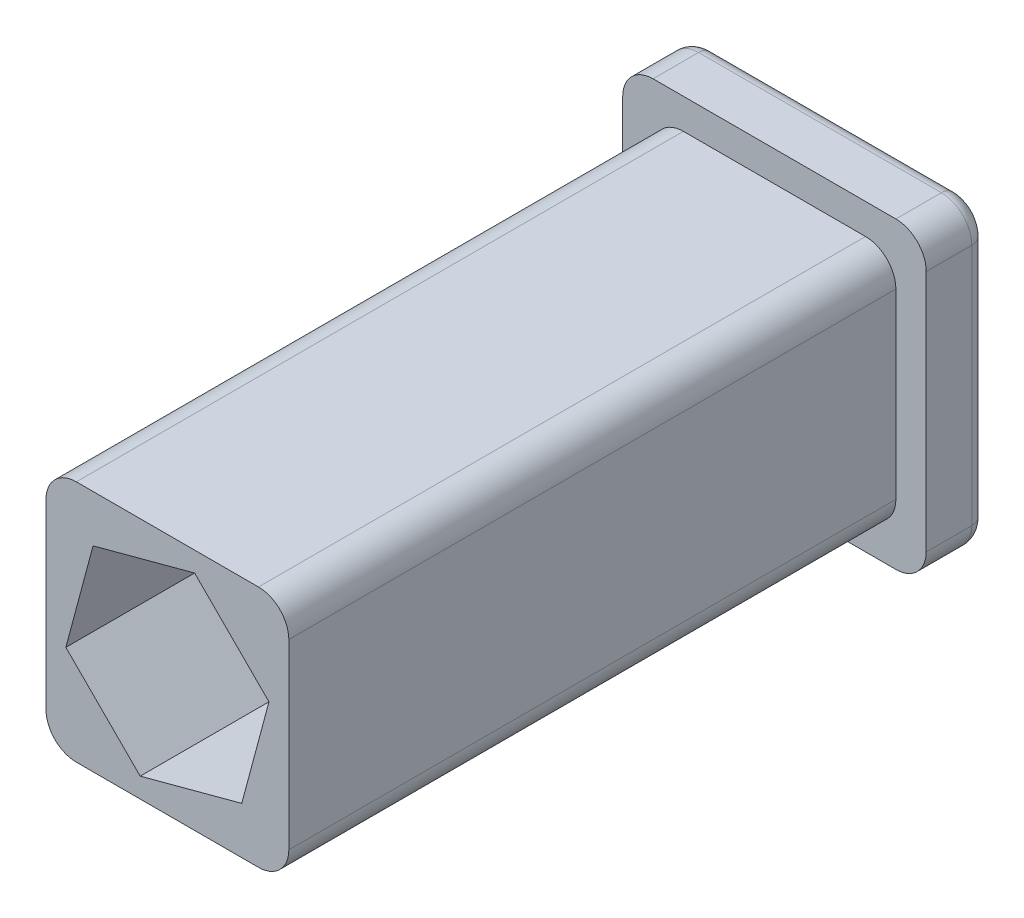
ISO-10303-21;
HEADER;
FILE_DESCRIPTION(('STEP AP214'),'2;1');
FILE_NAME('part.step','',(''),(''),'','','');
FILE_SCHEMA(('AUTOMOTIVE_DESIGN { 1 0 10303 214 1 1 1 1 }'));
ENDSEC;
DATA;
#1=APPLICATION_CONTEXT('core data for automotive mechanical design processes');
#2=APPLICATION_PROTOCOL_DEFINITION('international standard','automotive_design',2000,#1);
#3=PRODUCT_CONTEXT('',#1,'mechanical');
#4=PRODUCT('Part','Part','',(#3));
#5=PRODUCT_RELATED_PRODUCT_CATEGORY('part','',(#4));
#6=PRODUCT_DEFINITION_FORMATION('','',#4);
#7=PRODUCT_DEFINITION_CONTEXT('part definition',#1,'design');
#8=PRODUCT_DEFINITION('design','',#6,#7);
#9=PRODUCT_DEFINITION_SHAPE('','',#8);
#10=(LENGTH_UNIT() NAMED_UNIT(*) SI_UNIT(.MILLI.,.METRE.));
#11=(NAMED_UNIT(*) PLANE_ANGLE_UNIT() SI_UNIT($,.RADIAN.));
#12=(NAMED_UNIT(*) SI_UNIT($,.STERADIAN.) SOLID_ANGLE_UNIT());
#13=UNCERTAINTY_MEASURE_WITH_UNIT(LENGTH_MEASURE(1.E-05),#10,'distance_accuracy_value','');
#14=(GEOMETRIC_REPRESENTATION_CONTEXT(3) GLOBAL_UNCERTAINTY_ASSIGNED_CONTEXT((#13)) GLOBAL_UNIT_ASSIGNED_CONTEXT((#10,
#11,#12)) REPRESENTATION_CONTEXT('',''));
#15=CARTESIAN_POINT('',(0.,0.,0.));
#16=DIRECTION('',(0.,0.,1.));
#17=DIRECTION('',(1.,0.,0.));
#18=AXIS2_PLACEMENT_3D('',#15,#16,#17);
#19=CARTESIAN_POINT('',(-9.08256880733945,1.39908256880734,0.));
#20=DIRECTION('',(0.,0.,-1.));
#21=DIRECTION('',(-1.,0.,0.));
#22=AXIS2_PLACEMENT_3D('',#19,#20,#21);
#23=CYLINDRICAL_SURFACE('',#22,1.7);
#24=CARTESIAN_POINT('',(-9.08256880733945,1.39908256880734,0.));
#25=DIRECTION('',(0.,0.,-1.));
#26=DIRECTION('',(-1.,0.,0.));
#27=AXIS2_PLACEMENT_3D('',#24,#25,#26);
#28=CIRCLE('',#27,1.7);
#29=CARTESIAN_POINT('',(-10.7825688073394,1.39908256880734,0.));
#30=VERTEX_POINT('',#29);
#31=EDGE_CURVE('E288',#30,#30,#28,.T.);
#32=ORIENTED_EDGE('',*,*,#31,.T.);
#33=EDGE_LOOP('',(#32));
#34=FACE_BOUND('',#33,.T.);
#35=CARTESIAN_POINT('',(-9.08256880733945,1.39908256880734,2.));
#36=DIRECTION('',(0.,0.,1.));
#37=DIRECTION('',(1.,0.,0.));
#38=AXIS2_PLACEMENT_3D('',#35,#36,#37);
#39=CIRCLE('',#38,1.7);
#40=CARTESIAN_POINT('',(-7.38256880733945,1.39908256880734,2.));
#41=VERTEX_POINT('',#40);
#42=EDGE_CURVE('E45',#41,#41,#39,.F.);
#43=ORIENTED_EDGE('',*,*,#42,.F.);
#44=EDGE_LOOP('',(#43));
#45=FACE_BOUND('',#44,.T.);
#46=ADVANCED_FACE('F41',(#34,#45),#23,.F.);
#47=CARTESIAN_POINT('',(-14.0825688073394,6.39908256880734,2.));
#48=DIRECTION('',(1.,0.,0.));
#49=DIRECTION('',(0.,1.,0.));
#50=AXIS2_PLACEMENT_3D('',#47,#48,#49);
#51=PLANE('',#50);
#52=DIRECTION('',(0.,0.,-1.));
#53=VECTOR('',#52,1.);
#54=CARTESIAN_POINT('',(-14.0825688073394,5.39908256880734,2.));
#55=LINE('',#54,#53);
#56=CARTESIAN_POINT('',(-14.0825688073394,5.39908256880734,2.));
#57=VERTEX_POINT('',#56);
#58=CARTESIAN_POINT('',(-14.0825688073394,5.39908256880734,0.5));
#59=VERTEX_POINT('',#58);
#60=EDGE_CURVE('E363',#57,#59,#55,.T.);
#61=ORIENTED_EDGE('',*,*,#60,.T.);
#62=DIRECTION('',(0.,-1.,0.));
#63=VECTOR('',#62,1.);
#64=CARTESIAN_POINT('',(-14.0825688073394,6.39908256880734,0.5));
#65=LINE('',#64,#63);
#66=CARTESIAN_POINT('',(-14.0825688073394,-2.60091743119266,0.5));
#67=VERTEX_POINT('',#66);
#68=EDGE_CURVE('E416',#59,#67,#65,.T.);
#69=ORIENTED_EDGE('',*,*,#68,.T.);
#70=DIRECTION('',(0.,0.,-1.));
#71=VECTOR('',#70,1.);
#72=CARTESIAN_POINT('',(-14.0825688073394,-2.60091743119266,2.));
#73=LINE('',#72,#71);
#74=CARTESIAN_POINT('',(-14.0825688073394,-2.60091743119266,2.));
#75=VERTEX_POINT('',#74);
#76=EDGE_CURVE('E360',#67,#75,#73,.F.);
#77=ORIENTED_EDGE('',*,*,#76,.T.);
#78=DIRECTION('',(0.,-1.,0.));
#79=VECTOR('',#78,1.);
#80=CARTESIAN_POINT('',(-14.0825688073394,6.39908256880734,2.));
#81=LINE('',#80,#79);
#82=EDGE_CURVE('E324',#57,#75,#81,.T.);
#83=ORIENTED_EDGE('',*,*,#82,.F.);
#84=EDGE_LOOP('',(#61,#69,#77,#83));
#85=FACE_BOUND('',#84,.T.);
#86=ADVANCED_FACE('F551',(#85),#51,.F.);
#87=CARTESIAN_POINT('',(-14.0825688073394,-3.60091743119266,2.));
#88=DIRECTION('',(0.,1.,0.));
#89=DIRECTION('',(-1.,0.,0.));
#90=AXIS2_PLACEMENT_3D('',#87,#88,#89);
#91=PLANE('',#90);
#92=DIRECTION('',(0.,0.,-1.));
#93=VECTOR('',#92,1.);
#94=CARTESIAN_POINT('',(-13.0825688073394,-3.60091743119266,2.));
#95=LINE('',#94,#93);
#96=CARTESIAN_POINT('',(-13.0825688073394,-3.60091743119266,2.));
#97=VERTEX_POINT('',#96);
#98=CARTESIAN_POINT('',(-13.0825688073394,-3.60091743119266,0.5));
#99=VERTEX_POINT('',#98);
#100=EDGE_CURVE('E367',#97,#99,#95,.T.);
#101=ORIENTED_EDGE('',*,*,#100,.T.);
#102=DIRECTION('',(1.,0.,0.));
#103=VECTOR('',#102,1.);
#104=CARTESIAN_POINT('',(-14.0825688073394,-3.60091743119266,0.5));
#105=LINE('',#104,#103);
#106=CARTESIAN_POINT('',(-5.08256880733945,-3.60091743119266,0.5));
#107=VERTEX_POINT('',#106);
#108=EDGE_CURVE('E422',#99,#107,#105,.T.);
#109=ORIENTED_EDGE('',*,*,#108,.T.);
#110=DIRECTION('',(0.,0.,-1.));
#111=VECTOR('',#110,1.);
#112=CARTESIAN_POINT('',(-5.08256880733945,-3.60091743119266,2.));
#113=LINE('',#112,#111);
#114=CARTESIAN_POINT('',(-5.08256880733945,-3.60091743119266,2.));
#115=VERTEX_POINT('',#114);
#116=EDGE_CURVE('E375',#107,#115,#113,.F.);
#117=ORIENTED_EDGE('',*,*,#116,.T.);
#118=DIRECTION('',(1.,0.,0.));
#119=VECTOR('',#118,1.);
#120=CARTESIAN_POINT('',(-14.0825688073394,-3.60091743119266,2.));
#121=LINE('',#120,#119);
#122=EDGE_CURVE('E328',#97,#115,#121,.T.);
#123=ORIENTED_EDGE('',*,*,#122,.F.);
#124=EDGE_LOOP('',(#101,#109,#117,#123));
#125=FACE_BOUND('',#124,.T.);
#126=ADVANCED_FACE('F557',(#125),#91,.F.);
#127=CARTESIAN_POINT('',(-4.08256880733945,6.39908256880734,2.));
#128=DIRECTION('',(-1.,0.,0.));
#129=DIRECTION('',(0.,0.,1.));
#130=AXIS2_PLACEMENT_3D('',#127,#128,#129);
#131=PLANE('',#130);
#132=DIRECTION('',(0.,0.,-1.));
#133=VECTOR('',#132,1.);
#134=CARTESIAN_POINT('',(-4.08256880733945,-2.60091743119266,2.));
#135=LINE('',#134,#133);
#136=CARTESIAN_POINT('',(-4.08256880733945,-2.60091743119266,2.));
#137=VERTEX_POINT('',#136);
#138=CARTESIAN_POINT('',(-4.08256880733945,-2.60091743119266,0.5));
#139=VERTEX_POINT('',#138);
#140=EDGE_CURVE('E371',#137,#139,#135,.T.);
#141=ORIENTED_EDGE('',*,*,#140,.T.);
#142=DIRECTION('',(0.,1.,0.));
#143=VECTOR('',#142,1.);
#144=CARTESIAN_POINT('',(-4.08256880733945,6.39908256880734,0.5));
#145=LINE('',#144,#143);
#146=CARTESIAN_POINT('',(-4.08256880733945,5.39908256880734,0.5));
#147=VERTEX_POINT('',#146);
#148=EDGE_CURVE('E428',#139,#147,#145,.T.);
#149=ORIENTED_EDGE('',*,*,#148,.T.);
#150=DIRECTION('',(0.,0.,-1.));
#151=VECTOR('',#150,1.);
#152=CARTESIAN_POINT('',(-4.08256880733945,5.39908256880734,2.));
#153=LINE('',#152,#151);
#154=CARTESIAN_POINT('',(-4.08256880733945,5.39908256880734,2.));
#155=VERTEX_POINT('',#154);
#156=EDGE_CURVE('E348',#147,#155,#153,.F.);
#157=ORIENTED_EDGE('',*,*,#156,.T.);
#158=DIRECTION('',(0.,1.,0.));
#159=VECTOR('',#158,1.);
#160=CARTESIAN_POINT('',(-4.08256880733945,6.39908256880734,2.));
#161=LINE('',#160,#159);
#162=EDGE_CURVE('E333',#137,#155,#161,.T.);
#163=ORIENTED_EDGE('',*,*,#162,.F.);
#164=EDGE_LOOP('',(#141,#149,#157,#163));
#165=FACE_BOUND('',#164,.T.);
#166=ADVANCED_FACE('F586',(#165),#131,.F.);
#167=CARTESIAN_POINT('',(-14.0825688073394,6.39908256880734,2.));
#168=DIRECTION('',(0.,-1.,0.));
#169=DIRECTION('',(0.,0.,-1.));
#170=AXIS2_PLACEMENT_3D('',#167,#168,#169);
#171=PLANE('',#170);
#172=DIRECTION('',(0.,0.,-1.));
#173=VECTOR('',#172,1.);
#174=CARTESIAN_POINT('',(-5.08256880733945,6.39908256880734,2.));
#175=LINE('',#174,#173);
#176=CARTESIAN_POINT('',(-5.08256880733945,6.39908256880734,2.));
#177=VERTEX_POINT('',#176);
#178=CARTESIAN_POINT('',(-5.08256880733945,6.39908256880734,0.5));
#179=VERTEX_POINT('',#178);
#180=EDGE_CURVE('E344',#177,#179,#175,.T.);
#181=ORIENTED_EDGE('',*,*,#180,.T.);
#182=DIRECTION('',(-1.,0.,0.));
#183=VECTOR('',#182,1.);
#184=CARTESIAN_POINT('',(-14.0825688073394,6.39908256880734,0.5));
#185=LINE('',#184,#183);
#186=CARTESIAN_POINT('',(-13.0825688073394,6.39908256880734,0.5));
#187=VERTEX_POINT('',#186);
#188=EDGE_CURVE('E410',#179,#187,#185,.T.);
#189=ORIENTED_EDGE('',*,*,#188,.T.);
#190=DIRECTION('',(0.,0.,-1.));
#191=VECTOR('',#190,1.);
#192=CARTESIAN_POINT('',(-13.0825688073394,6.39908256880734,2.));
#193=LINE('',#192,#191);
#194=CARTESIAN_POINT('',(-13.0825688073394,6.39908256880734,2.));
#195=VERTEX_POINT('',#194);
#196=EDGE_CURVE('E341',#187,#195,#193,.F.);
#197=ORIENTED_EDGE('',*,*,#196,.T.);
#198=DIRECTION('',(-1.,0.,0.));
#199=VECTOR('',#198,1.);
#200=CARTESIAN_POINT('',(-14.0825688073394,6.39908256880734,2.));
#201=LINE('',#200,#199);
#202=EDGE_CURVE('E337',#177,#195,#201,.T.);
#203=ORIENTED_EDGE('',*,*,#202,.F.);
#204=EDGE_LOOP('',(#181,#189,#197,#203));
#205=FACE_BOUND('',#204,.T.);
#206=ADVANCED_FACE('F579',(#205),#171,.F.);
#207=CARTESIAN_POINT('',(0.,0.,2.));
#208=DIRECTION('',(0.,0.,1.));
#209=DIRECTION('',(1.,0.,0.));
#210=AXIS2_PLACEMENT_3D('',#207,#208,#209);
#211=PLANE('',#210);
#212=DIRECTION('',(0.,-1.,0.));
#213=VECTOR('',#212,1.);
#214=CARTESIAN_POINT('',(-13.0825688073395,5.39908256880734,2.));
#215=LINE('',#214,#213);
#216=CARTESIAN_POINT('',(-13.0825688073395,4.39908256880734,2.));
#217=VERTEX_POINT('',#216);
#218=CARTESIAN_POINT('',(-13.0825688073394,-1.60091743119266,2.));
#219=VERTEX_POINT('',#218);
#220=EDGE_CURVE('E292',#217,#219,#215,.T.);
#221=ORIENTED_EDGE('',*,*,#220,.F.);
#222=CARTESIAN_POINT('',(-12.0825688073395,4.39908256880734,2.));
#223=DIRECTION('',(0.,0.,1.));
#224=DIRECTION('',(1.,0.,0.));
#225=AXIS2_PLACEMENT_3D('',#222,#223,#224);
#226=CIRCLE('',#225,1.);
#227=CARTESIAN_POINT('',(-12.0825688073395,5.39908256880734,2.));
#228=VERTEX_POINT('',#227);
#229=EDGE_CURVE('E11',#217,#228,#226,.F.);
#230=ORIENTED_EDGE('',*,*,#229,.T.);
#231=DIRECTION('',(-1.,0.,0.));
#232=VECTOR('',#231,1.);
#233=CARTESIAN_POINT('',(-13.0825688073395,5.39908256880734,2.));
#234=LINE('',#233,#232);
#235=CARTESIAN_POINT('',(-6.08256880733945,5.39908256880734,2.));
#236=VERTEX_POINT('',#235);
#237=EDGE_CURVE('E298',#236,#228,#234,.T.);
#238=ORIENTED_EDGE('',*,*,#237,.F.);
#239=CARTESIAN_POINT('',(-6.08256880733945,4.39908256880734,2.));
#240=DIRECTION('',(0.,0.,1.));
#241=DIRECTION('',(1.,0.,0.));
#242=AXIS2_PLACEMENT_3D('',#239,#240,#241);
#243=CIRCLE('',#242,1.);
#244=CARTESIAN_POINT('',(-5.08256880733945,4.39908256880734,2.));
#245=VERTEX_POINT('',#244);
#246=EDGE_CURVE('E51',#236,#245,#243,.F.);
#247=ORIENTED_EDGE('',*,*,#246,.T.);
#248=DIRECTION('',(0.,1.,0.));
#249=VECTOR('',#248,1.);
#250=CARTESIAN_POINT('',(-5.08256880733945,5.39908256880734,2.));
#251=LINE('',#250,#249);
#252=CARTESIAN_POINT('',(-5.08256880733945,-1.60091743119266,2.));
#253=VERTEX_POINT('',#252);
#254=EDGE_CURVE('E318',#253,#245,#251,.T.);
#255=ORIENTED_EDGE('',*,*,#254,.F.);
#256=CARTESIAN_POINT('',(-6.08256880733945,-1.60091743119266,2.));
#257=DIRECTION('',(0.,0.,1.));
#258=DIRECTION('',(1.,0.,0.));
#259=AXIS2_PLACEMENT_3D('',#256,#257,#258);
#260=CIRCLE('',#259,1.);
#261=CARTESIAN_POINT('',(-6.08256880733945,-2.60091743119266,2.));
#262=VERTEX_POINT('',#261);
#263=EDGE_CURVE('E502',#253,#262,#260,.F.);
#264=ORIENTED_EDGE('',*,*,#263,.T.);
#265=DIRECTION('',(1.,0.,0.));
#266=VECTOR('',#265,1.);
#267=CARTESIAN_POINT('',(-13.0825688073394,-2.60091743119266,2.));
#268=LINE('',#267,#266);
#269=CARTESIAN_POINT('',(-12.0825688073394,-2.60091743119266,2.));
#270=VERTEX_POINT('',#269);
#271=EDGE_CURVE('E314',#270,#262,#268,.T.);
#272=ORIENTED_EDGE('',*,*,#271,.F.);
#273=CARTESIAN_POINT('',(-12.0825688073394,-1.60091743119266,2.));
#274=DIRECTION('',(0.,0.,1.));
#275=DIRECTION('',(1.,0.,0.));
#276=AXIS2_PLACEMENT_3D('',#273,#274,#275);
#277=CIRCLE('',#276,1.);
#278=EDGE_CURVE('E499',#270,#219,#277,.F.);
#279=ORIENTED_EDGE('',*,*,#278,.T.);
#280=EDGE_LOOP('',(#221,#230,#238,#247,#255,#264,#272,#279));
#281=FACE_BOUND('',#280,.T.);
#282=ORIENTED_EDGE('',*,*,#122,.T.);
#283=CARTESIAN_POINT('',(-5.08256880733945,-2.60091743119266,2.));
#284=DIRECTION('',(0.,0.,1.));
#285=DIRECTION('',(1.,0.,0.));
#286=AXIS2_PLACEMENT_3D('',#283,#284,#285);
#287=CIRCLE('',#286,1.);
#288=EDGE_CURVE('E378',#115,#137,#287,.T.);
#289=ORIENTED_EDGE('',*,*,#288,.T.);
#290=ORIENTED_EDGE('',*,*,#162,.T.);
#291=CARTESIAN_POINT('',(-5.08256880733945,5.39908256880734,2.));
#292=DIRECTION('',(0.,0.,1.));
#293=DIRECTION('',(1.,0.,0.));
#294=AXIS2_PLACEMENT_3D('',#291,#292,#293);
#295=CIRCLE('',#294,1.);
#296=EDGE_CURVE('E357',#155,#177,#295,.T.);
#297=ORIENTED_EDGE('',*,*,#296,.T.);
#298=ORIENTED_EDGE('',*,*,#202,.T.);
#299=CARTESIAN_POINT('',(-13.0825688073394,5.39908256880734,2.));
#300=DIRECTION('',(0.,0.,1.));
#301=DIRECTION('',(1.,0.,0.));
#302=AXIS2_PLACEMENT_3D('',#299,#300,#301);
#303=CIRCLE('',#302,1.);
#304=EDGE_CURVE('E354',#195,#57,#303,.T.);
#305=ORIENTED_EDGE('',*,*,#304,.T.);
#306=ORIENTED_EDGE('',*,*,#82,.T.);
#307=CARTESIAN_POINT('',(-13.0825688073394,-2.60091743119266,2.));
#308=DIRECTION('',(0.,0.,1.));
#309=DIRECTION('',(1.,0.,0.));
#310=AXIS2_PLACEMENT_3D('',#307,#308,#309);
#311=CIRCLE('',#310,1.);
#312=EDGE_CURVE('E351',#75,#97,#311,.T.);
#313=ORIENTED_EDGE('',*,*,#312,.T.);
#314=EDGE_LOOP('',(#282,#289,#290,#297,#298,#305,#306,#313));
#315=FACE_BOUND('',#314,.T.);
#316=ADVANCED_FACE('F507',(#281,#315),#211,.T.);
#317=CARTESIAN_POINT('',(0.,0.,0.));
#318=DIRECTION('',(0.,0.,1.));
#319=DIRECTION('',(1.,0.,0.));
#320=AXIS2_PLACEMENT_3D('',#317,#318,#319);
#321=PLANE('',#320);
#322=ORIENTED_EDGE('',*,*,#31,.F.);
#323=EDGE_LOOP('',(#322));
#324=FACE_BOUND('',#323,.T.);
#325=DIRECTION('',(-1.,0.,0.));
#326=VECTOR('',#325,1.);
#327=CARTESIAN_POINT('',(0.,5.89908256880734,0.));
#328=LINE('',#327,#326);
#329=CARTESIAN_POINT('',(-13.0825688073394,5.89908256880734,0.));
#330=VERTEX_POINT('',#329);
#331=CARTESIAN_POINT('',(-5.08256880733945,5.89908256880734,0.));
#332=VERTEX_POINT('',#331);
#333=EDGE_CURVE('E399',#330,#332,#328,.F.);
#334=ORIENTED_EDGE('',*,*,#333,.T.);
#335=CARTESIAN_POINT('',(-5.08256880733945,5.39908256880734,0.));
#336=DIRECTION('',(0.,0.,1.));
#337=DIRECTION('',(1.,0.,0.));
#338=AXIS2_PLACEMENT_3D('',#335,#336,#337);
#339=CIRCLE('',#338,0.5);
#340=CARTESIAN_POINT('',(-4.58256880733945,5.39908256880734,0.));
#341=VERTEX_POINT('',#340);
#342=EDGE_CURVE('E402',#332,#341,#339,.F.);
#343=ORIENTED_EDGE('',*,*,#342,.T.);
#344=DIRECTION('',(0.,1.,0.));
#345=VECTOR('',#344,1.);
#346=CARTESIAN_POINT('',(-4.58256880733945,0.,0.));
#347=LINE('',#346,#345);
#348=CARTESIAN_POINT('',(-4.58256880733945,-2.60091743119266,0.));
#349=VERTEX_POINT('',#348);
#350=EDGE_CURVE('E381',#341,#349,#347,.F.);
#351=ORIENTED_EDGE('',*,*,#350,.T.);
#352=CARTESIAN_POINT('',(-5.08256880733945,-2.60091743119266,0.));
#353=DIRECTION('',(0.,0.,1.));
#354=DIRECTION('',(1.,0.,0.));
#355=AXIS2_PLACEMENT_3D('',#352,#353,#354);
#356=CIRCLE('',#355,0.5);
#357=CARTESIAN_POINT('',(-5.08256880733945,-3.10091743119266,0.));
#358=VERTEX_POINT('',#357);
#359=EDGE_CURVE('E384',#349,#358,#356,.F.);
#360=ORIENTED_EDGE('',*,*,#359,.T.);
#361=DIRECTION('',(1.,0.,0.));
#362=VECTOR('',#361,1.);
#363=CARTESIAN_POINT('',(0.,-3.10091743119266,0.));
#364=LINE('',#363,#362);
#365=CARTESIAN_POINT('',(-13.0825688073394,-3.10091743119266,0.));
#366=VERTEX_POINT('',#365);
#367=EDGE_CURVE('E387',#358,#366,#364,.F.);
#368=ORIENTED_EDGE('',*,*,#367,.T.);
#369=CARTESIAN_POINT('',(-13.0825688073394,-2.60091743119266,0.));
#370=DIRECTION('',(0.,0.,1.));
#371=DIRECTION('',(1.,0.,0.));
#372=AXIS2_PLACEMENT_3D('',#369,#370,#371);
#373=CIRCLE('',#372,0.5);
#374=CARTESIAN_POINT('',(-13.5825688073394,-2.60091743119266,0.));
#375=VERTEX_POINT('',#374);
#376=EDGE_CURVE('E390',#366,#375,#373,.F.);
#377=ORIENTED_EDGE('',*,*,#376,.T.);
#378=DIRECTION('',(0.,-1.,0.));
#379=VECTOR('',#378,1.);
#380=CARTESIAN_POINT('',(-13.5825688073394,0.,0.));
#381=LINE('',#380,#379);
#382=CARTESIAN_POINT('',(-13.5825688073394,5.39908256880734,0.));
#383=VERTEX_POINT('',#382);
#384=EDGE_CURVE('E393',#375,#383,#381,.F.);
#385=ORIENTED_EDGE('',*,*,#384,.T.);
#386=CARTESIAN_POINT('',(-13.0825688073394,5.39908256880734,0.));
#387=DIRECTION('',(0.,0.,1.));
#388=DIRECTION('',(1.,0.,0.));
#389=AXIS2_PLACEMENT_3D('',#386,#387,#388);
#390=CIRCLE('',#389,0.5);
#391=EDGE_CURVE('E396',#383,#330,#390,.F.);
#392=ORIENTED_EDGE('',*,*,#391,.T.);
#393=EDGE_LOOP('',(#334,#343,#351,#360,#368,#377,#385,#392));
#394=FACE_BOUND('',#393,.T.);
#395=ADVANCED_FACE('F578',(#324,#394),#321,.F.);
#396=CARTESIAN_POINT('',(-5.08256880733945,5.39908256880734,2.));
#397=DIRECTION('',(0.,0.,-1.));
#398=DIRECTION('',(-1.,0.,0.));
#399=AXIS2_PLACEMENT_3D('',#396,#397,#398);
#400=CYLINDRICAL_SURFACE('',#399,1.);
#401=ORIENTED_EDGE('',*,*,#156,.F.);
#402=CARTESIAN_POINT('',(-5.08256880733945,5.39908256880734,0.5));
#403=DIRECTION('',(0.,0.,1.));
#404=DIRECTION('',(1.,0.,0.));
#405=AXIS2_PLACEMENT_3D('',#402,#403,#404);
#406=CIRCLE('',#405,1.);
#407=EDGE_CURVE('E406',#147,#179,#406,.T.);
#408=ORIENTED_EDGE('',*,*,#407,.T.);
#409=ORIENTED_EDGE('',*,*,#180,.F.);
#410=ORIENTED_EDGE('',*,*,#296,.F.);
#411=EDGE_LOOP('',(#401,#408,#409,#410));
#412=FACE_BOUND('',#411,.T.);
#413=ADVANCED_FACE('F582',(#412),#400,.T.);
#414=CARTESIAN_POINT('',(-13.0825688073394,5.39908256880734,2.));
#415=DIRECTION('',(0.,0.,-1.));
#416=DIRECTION('',(-1.,0.,0.));
#417=AXIS2_PLACEMENT_3D('',#414,#415,#416);
#418=CYLINDRICAL_SURFACE('',#417,1.);
#419=ORIENTED_EDGE('',*,*,#196,.F.);
#420=CARTESIAN_POINT('',(-13.0825688073394,5.39908256880734,0.5));
#421=DIRECTION('',(0.,0.,1.));
#422=DIRECTION('',(1.,0.,0.));
#423=AXIS2_PLACEMENT_3D('',#420,#421,#422);
#424=CIRCLE('',#423,1.);
#425=EDGE_CURVE('E413',#187,#59,#424,.T.);
#426=ORIENTED_EDGE('',*,*,#425,.T.);
#427=ORIENTED_EDGE('',*,*,#60,.F.);
#428=ORIENTED_EDGE('',*,*,#304,.F.);
#429=EDGE_LOOP('',(#419,#426,#427,#428));
#430=FACE_BOUND('',#429,.T.);
#431=ADVANCED_FACE('F596',(#430),#418,.T.);
#432=CARTESIAN_POINT('',(-13.0825688073394,-2.60091743119266,2.));
#433=DIRECTION('',(0.,0.,-1.));
#434=DIRECTION('',(-1.,0.,0.));
#435=AXIS2_PLACEMENT_3D('',#432,#433,#434);
#436=CYLINDRICAL_SURFACE('',#435,1.);
#437=ORIENTED_EDGE('',*,*,#76,.F.);
#438=CARTESIAN_POINT('',(-13.0825688073394,-2.60091743119266,0.5));
#439=DIRECTION('',(0.,0.,1.));
#440=DIRECTION('',(1.,0.,0.));
#441=AXIS2_PLACEMENT_3D('',#438,#439,#440);
#442=CIRCLE('',#441,1.);
#443=EDGE_CURVE('E419',#67,#99,#442,.T.);
#444=ORIENTED_EDGE('',*,*,#443,.T.);
#445=ORIENTED_EDGE('',*,*,#100,.F.);
#446=ORIENTED_EDGE('',*,*,#312,.F.);
#447=EDGE_LOOP('',(#437,#444,#445,#446));
#448=FACE_BOUND('',#447,.T.);
#449=ADVANCED_FACE('F600',(#448),#436,.T.);
#450=CARTESIAN_POINT('',(-5.08256880733945,-2.60091743119266,2.));
#451=DIRECTION('',(0.,0.,-1.));
#452=DIRECTION('',(-1.,0.,0.));
#453=AXIS2_PLACEMENT_3D('',#450,#451,#452);
#454=CYLINDRICAL_SURFACE('',#453,1.);
#455=ORIENTED_EDGE('',*,*,#116,.F.);
#456=CARTESIAN_POINT('',(-5.08256880733945,-2.60091743119266,0.5));
#457=DIRECTION('',(0.,0.,1.));
#458=DIRECTION('',(1.,0.,0.));
#459=AXIS2_PLACEMENT_3D('',#456,#457,#458);
#460=CIRCLE('',#459,1.);
#461=EDGE_CURVE('E425',#107,#139,#460,.T.);
#462=ORIENTED_EDGE('',*,*,#461,.T.);
#463=ORIENTED_EDGE('',*,*,#140,.F.);
#464=ORIENTED_EDGE('',*,*,#288,.F.);
#465=EDGE_LOOP('',(#455,#462,#463,#464));
#466=FACE_BOUND('',#465,.T.);
#467=ADVANCED_FACE('F604',(#466),#454,.T.);
#468=CARTESIAN_POINT('',(-13.0825688073394,-2.60091743119266,0.5));
#469=DIRECTION('',(0.,0.,1.));
#470=DIRECTION('',(1.,0.,0.));
#471=AXIS2_PLACEMENT_3D('',#468,#469,#470);
#472=DEGENERATE_TOROIDAL_SURFACE('',#471,0.5,0.5,.T.);
#473=CARTESIAN_POINT('',(-13.0825688073394,-3.10091743119266,0.5));
#474=DIRECTION('',(1.,0.,0.));
#475=DIRECTION('',(0.,0.,-1.));
#476=AXIS2_PLACEMENT_3D('',#473,#474,#475);
#477=CIRCLE('',#476,0.5);
#478=EDGE_CURVE('E453',#99,#366,#477,.T.);
#479=ORIENTED_EDGE('',*,*,#478,.F.);
#480=ORIENTED_EDGE('',*,*,#443,.F.);
#481=CARTESIAN_POINT('',(-13.5825688073394,-2.60091743119266,0.5));
#482=DIRECTION('',(0.,1.,0.));
#483=DIRECTION('',(0.,0.,1.));
#484=AXIS2_PLACEMENT_3D('',#481,#482,#483);
#485=CIRCLE('',#484,0.5);
#486=EDGE_CURVE('E329',#375,#67,#485,.T.);
#487=ORIENTED_EDGE('',*,*,#486,.F.);
#488=ORIENTED_EDGE('',*,*,#376,.F.);
#489=EDGE_LOOP('',(#479,#480,#487,#488));
#490=FACE_BOUND('',#489,.T.);
#491=ADVANCED_FACE('F608',(#490),#472,.T.);
#492=CARTESIAN_POINT('',(-13.5825688073394,6.39908256880734,0.5));
#493=DIRECTION('',(0.,-1.,0.));
#494=DIRECTION('',(1.,0.,0.));
#495=AXIS2_PLACEMENT_3D('',#492,#493,#494);
#496=CYLINDRICAL_SURFACE('',#495,0.5);
#497=ORIENTED_EDGE('',*,*,#486,.T.);
#498=ORIENTED_EDGE('',*,*,#68,.F.);
#499=CARTESIAN_POINT('',(-13.5825688073394,5.39908256880734,0.5));
#500=DIRECTION('',(0.,1.,0.));
#501=DIRECTION('',(0.,0.,1.));
#502=AXIS2_PLACEMENT_3D('',#499,#500,#501);
#503=CIRCLE('',#502,0.5);
#504=EDGE_CURVE('E449',#383,#59,#503,.T.);
#505=ORIENTED_EDGE('',*,*,#504,.F.);
#506=ORIENTED_EDGE('',*,*,#384,.F.);
#507=EDGE_LOOP('',(#497,#498,#505,#506));
#508=FACE_BOUND('',#507,.T.);
#509=ADVANCED_FACE('F632',(#508),#496,.T.);
#510=CARTESIAN_POINT('',(-14.0825688073394,-3.10091743119266,0.5));
#511=DIRECTION('',(1.,0.,0.));
#512=DIRECTION('',(0.,1.,0.));
#513=AXIS2_PLACEMENT_3D('',#510,#511,#512);
#514=CYLINDRICAL_SURFACE('',#513,0.5);
#515=ORIENTED_EDGE('',*,*,#478,.T.);
#516=ORIENTED_EDGE('',*,*,#367,.F.);
#517=CARTESIAN_POINT('',(-5.08256880733945,-3.10091743119266,0.5));
#518=DIRECTION('',(1.,0.,0.));
#519=DIRECTION('',(0.,0.,-1.));
#520=AXIS2_PLACEMENT_3D('',#517,#518,#519);
#521=CIRCLE('',#520,0.5);
#522=EDGE_CURVE('E445',#107,#358,#521,.T.);
#523=ORIENTED_EDGE('',*,*,#522,.F.);
#524=ORIENTED_EDGE('',*,*,#108,.F.);
#525=EDGE_LOOP('',(#515,#516,#523,#524));
#526=FACE_BOUND('',#525,.T.);
#527=ADVANCED_FACE('F628',(#526),#514,.T.);
#528=CARTESIAN_POINT('',(-13.0825688073394,5.39908256880734,0.5));
#529=DIRECTION('',(0.,0.,1.));
#530=DIRECTION('',(1.,0.,0.));
#531=AXIS2_PLACEMENT_3D('',#528,#529,#530);
#532=DEGENERATE_TOROIDAL_SURFACE('',#531,0.5,0.5,.T.);
#533=ORIENTED_EDGE('',*,*,#504,.T.);
#534=ORIENTED_EDGE('',*,*,#425,.F.);
#535=CARTESIAN_POINT('',(-13.0825688073394,5.89908256880734,0.5));
#536=DIRECTION('',(1.,0.,0.));
#537=DIRECTION('',(0.,0.,-1.));
#538=AXIS2_PLACEMENT_3D('',#535,#536,#537);
#539=CIRCLE('',#538,0.5);
#540=EDGE_CURVE('E441',#330,#187,#539,.T.);
#541=ORIENTED_EDGE('',*,*,#540,.F.);
#542=ORIENTED_EDGE('',*,*,#391,.F.);
#543=EDGE_LOOP('',(#533,#534,#541,#542));
#544=FACE_BOUND('',#543,.T.);
#545=ADVANCED_FACE('F624',(#544),#532,.T.);
#546=CARTESIAN_POINT('',(-5.08256880733945,-2.60091743119266,0.5));
#547=DIRECTION('',(0.,0.,1.));
#548=DIRECTION('',(1.,0.,0.));
#549=AXIS2_PLACEMENT_3D('',#546,#547,#548);
#550=DEGENERATE_TOROIDAL_SURFACE('',#549,0.5,0.5,.T.);
#551=ORIENTED_EDGE('',*,*,#522,.T.);
#552=ORIENTED_EDGE('',*,*,#359,.F.);
#553=CARTESIAN_POINT('',(-4.58256880733945,-2.60091743119266,0.5));
#554=DIRECTION('',(0.,1.,0.));
#555=DIRECTION('',(0.,0.,1.));
#556=AXIS2_PLACEMENT_3D('',#553,#554,#555);
#557=CIRCLE('',#556,0.5);
#558=EDGE_CURVE('E437',#139,#349,#557,.T.);
#559=ORIENTED_EDGE('',*,*,#558,.F.);
#560=ORIENTED_EDGE('',*,*,#461,.F.);
#561=EDGE_LOOP('',(#551,#552,#559,#560));
#562=FACE_BOUND('',#561,.T.);
#563=ADVANCED_FACE('F620',(#562),#550,.T.);
#564=CARTESIAN_POINT('',(-14.0825688073394,5.89908256880734,0.5));
#565=DIRECTION('',(-1.,0.,0.));
#566=DIRECTION('',(0.,0.,1.));
#567=AXIS2_PLACEMENT_3D('',#564,#565,#566);
#568=CYLINDRICAL_SURFACE('',#567,0.5);
#569=ORIENTED_EDGE('',*,*,#540,.T.);
#570=ORIENTED_EDGE('',*,*,#188,.F.);
#571=CARTESIAN_POINT('',(-5.08256880733945,5.89908256880734,0.5));
#572=DIRECTION('',(1.,0.,0.));
#573=DIRECTION('',(0.,0.,-1.));
#574=AXIS2_PLACEMENT_3D('',#571,#572,#573);
#575=CIRCLE('',#574,0.5);
#576=EDGE_CURVE('E434',#332,#179,#575,.T.);
#577=ORIENTED_EDGE('',*,*,#576,.F.);
#578=ORIENTED_EDGE('',*,*,#333,.F.);
#579=EDGE_LOOP('',(#569,#570,#577,#578));
#580=FACE_BOUND('',#579,.T.);
#581=ADVANCED_FACE('F616',(#580),#568,.T.);
#582=CARTESIAN_POINT('',(-4.58256880733945,6.39908256880734,0.5));
#583=DIRECTION('',(0.,1.,0.));
#584=DIRECTION('',(0.,0.,1.));
#585=AXIS2_PLACEMENT_3D('',#582,#583,#584);
#586=CYLINDRICAL_SURFACE('',#585,0.5);
#587=ORIENTED_EDGE('',*,*,#558,.T.);
#588=ORIENTED_EDGE('',*,*,#350,.F.);
#589=CARTESIAN_POINT('',(-4.58256880733945,5.39908256880734,0.5));
#590=DIRECTION('',(0.,1.,0.));
#591=DIRECTION('',(0.,0.,1.));
#592=AXIS2_PLACEMENT_3D('',#589,#590,#591);
#593=CIRCLE('',#592,0.5);
#594=EDGE_CURVE('E310',#147,#341,#593,.T.);
#595=ORIENTED_EDGE('',*,*,#594,.F.);
#596=ORIENTED_EDGE('',*,*,#148,.F.);
#597=EDGE_LOOP('',(#587,#588,#595,#596));
#598=FACE_BOUND('',#597,.T.);
#599=ADVANCED_FACE('F612',(#598),#586,.T.);
#600=CARTESIAN_POINT('',(-5.08256880733945,5.39908256880734,0.5));
#601=DIRECTION('',(0.,0.,1.));
#602=DIRECTION('',(1.,0.,0.));
#603=AXIS2_PLACEMENT_3D('',#600,#601,#602);
#604=DEGENERATE_TOROIDAL_SURFACE('',#603,0.5,0.5,.T.);
#605=ORIENTED_EDGE('',*,*,#576,.T.);
#606=ORIENTED_EDGE('',*,*,#407,.F.);
#607=ORIENTED_EDGE('',*,*,#594,.T.);
#608=ORIENTED_EDGE('',*,*,#342,.F.);
#609=EDGE_LOOP('',(#605,#606,#607,#608));
#610=FACE_BOUND('',#609,.T.);
#611=ADVANCED_FACE('F575',(#610),#604,.T.);
#612=CARTESIAN_POINT('',(-13.0825688073395,5.39908256880734,22.));
#613=DIRECTION('',(1.,0.,0.));
#614=DIRECTION('',(0.,1.,0.));
#615=AXIS2_PLACEMENT_3D('',#612,#613,#614);
#616=PLANE('',#615);
#617=ORIENTED_EDGE('',*,*,#220,.T.);
#618=DIRECTION('',(0.,0.,-1.));
#619=VECTOR('',#618,1.);
#620=CARTESIAN_POINT('',(-13.0825688073394,-1.60091743119266,22.));
#621=LINE('',#620,#619);
#622=CARTESIAN_POINT('',(-13.0825688073394,-1.60091743119266,22.));
#623=VERTEX_POINT('',#622);
#624=EDGE_CURVE('E470',#219,#623,#621,.F.);
#625=ORIENTED_EDGE('',*,*,#624,.T.);
#626=DIRECTION('',(0.,-1.,0.));
#627=VECTOR('',#626,1.);
#628=CARTESIAN_POINT('',(-13.0825688073395,5.39908256880734,22.));
#629=LINE('',#628,#627);
#630=CARTESIAN_POINT('',(-13.0825688073395,4.39908256880734,22.));
#631=VERTEX_POINT('',#630);
#632=EDGE_CURVE('E293',#631,#623,#629,.T.);
#633=ORIENTED_EDGE('',*,*,#632,.F.);
#634=DIRECTION('',(0.,0.,-1.));
#635=VECTOR('',#634,1.);
#636=CARTESIAN_POINT('',(-13.0825688073395,4.39908256880734,22.));
#637=LINE('',#636,#635);
#638=EDGE_CURVE('E466',#631,#217,#637,.T.);
#639=ORIENTED_EDGE('',*,*,#638,.T.);
#640=EDGE_LOOP('',(#617,#625,#633,#639));
#641=FACE_BOUND('',#640,.T.);
#642=ADVANCED_FACE('F530',(#641),#616,.F.);
#643=CARTESIAN_POINT('',(-13.0825688073394,-2.60091743119266,22.));
#644=DIRECTION('',(0.,1.,0.));
#645=DIRECTION('',(0.,0.,1.));
#646=AXIS2_PLACEMENT_3D('',#643,#644,#645);
#647=PLANE('',#646);
#648=DIRECTION('',(1.,0.,0.));
#649=VECTOR('',#648,1.);
#650=CARTESIAN_POINT('',(-13.0825688073394,-2.60091743119266,22.));
#651=LINE('',#650,#649);
#652=CARTESIAN_POINT('',(-12.0825688073394,-2.60091743119266,22.));
#653=VERTEX_POINT('',#652);
#654=CARTESIAN_POINT('',(-6.08256880733945,-2.60091743119266,22.));
#655=VERTEX_POINT('',#654);
#656=EDGE_CURVE('E297',#653,#655,#651,.T.);
#657=ORIENTED_EDGE('',*,*,#656,.F.);
#658=DIRECTION('',(0.,0.,-1.));
#659=VECTOR('',#658,1.);
#660=CARTESIAN_POINT('',(-12.0825688073394,-2.60091743119266,22.));
#661=LINE('',#660,#659);
#662=EDGE_CURVE('E462',#653,#270,#661,.T.);
#663=ORIENTED_EDGE('',*,*,#662,.T.);
#664=ORIENTED_EDGE('',*,*,#271,.T.);
#665=DIRECTION('',(0.,0.,-1.));
#666=VECTOR('',#665,1.);
#667=CARTESIAN_POINT('',(-6.08256880733945,-2.60091743119266,22.));
#668=LINE('',#667,#666);
#669=EDGE_CURVE('E431',#262,#655,#668,.F.);
#670=ORIENTED_EDGE('',*,*,#669,.T.);
#671=EDGE_LOOP('',(#657,#663,#664,#670));
#672=FACE_BOUND('',#671,.T.);
#673=ADVANCED_FACE('F538',(#672),#647,.F.);
#674=CARTESIAN_POINT('',(-5.08256880733945,5.39908256880734,22.));
#675=DIRECTION('',(-1.,0.,0.));
#676=DIRECTION('',(0.,0.,1.));
#677=AXIS2_PLACEMENT_3D('',#674,#675,#676);
#678=PLANE('',#677);
#679=DIRECTION('',(0.,1.,0.));
#680=VECTOR('',#679,1.);
#681=CARTESIAN_POINT('',(-5.08256880733945,5.39908256880734,22.));
#682=LINE('',#681,#680);
#683=CARTESIAN_POINT('',(-5.08256880733945,-1.60091743119266,22.));
#684=VERTEX_POINT('',#683);
#685=CARTESIAN_POINT('',(-5.08256880733945,4.39908256880734,22.));
#686=VERTEX_POINT('',#685);
#687=EDGE_CURVE('E302',#684,#686,#682,.T.);
#688=ORIENTED_EDGE('',*,*,#687,.F.);
#689=DIRECTION('',(0.,0.,-1.));
#690=VECTOR('',#689,1.);
#691=CARTESIAN_POINT('',(-5.08256880733945,-1.60091743119266,22.));
#692=LINE('',#691,#690);
#693=EDGE_CURVE('E488',#684,#253,#692,.T.);
#694=ORIENTED_EDGE('',*,*,#693,.T.);
#695=ORIENTED_EDGE('',*,*,#254,.T.);
#696=DIRECTION('',(0.,0.,-1.));
#697=VECTOR('',#696,1.);
#698=CARTESIAN_POINT('',(-5.08256880733945,4.39908256880734,22.));
#699=LINE('',#698,#697);
#700=EDGE_CURVE('E485',#245,#686,#699,.F.);
#701=ORIENTED_EDGE('',*,*,#700,.T.);
#702=EDGE_LOOP('',(#688,#694,#695,#701));
#703=FACE_BOUND('',#702,.T.);
#704=ADVANCED_FACE('F514',(#703),#678,.F.);
#705=CARTESIAN_POINT('',(-13.0825688073395,5.39908256880734,22.));
#706=DIRECTION('',(0.,-1.,0.));
#707=DIRECTION('',(1.,0.,0.));
#708=AXIS2_PLACEMENT_3D('',#705,#706,#707);
#709=PLANE('',#708);
#710=DIRECTION('',(-1.,0.,0.));
#711=VECTOR('',#710,1.);
#712=CARTESIAN_POINT('',(-13.0825688073395,5.39908256880734,22.));
#713=LINE('',#712,#711);
#714=CARTESIAN_POINT('',(-6.08256880733945,5.39908256880734,22.));
#715=VERTEX_POINT('',#714);
#716=CARTESIAN_POINT('',(-12.0825688073395,5.39908256880734,22.));
#717=VERTEX_POINT('',#716);
#718=EDGE_CURVE('E306',#715,#717,#713,.T.);
#719=ORIENTED_EDGE('',*,*,#718,.F.);
#720=DIRECTION('',(0.,0.,-1.));
#721=VECTOR('',#720,1.);
#722=CARTESIAN_POINT('',(-6.08256880733945,5.39908256880734,22.));
#723=LINE('',#722,#721);
#724=EDGE_CURVE('E495',#715,#236,#723,.T.);
#725=ORIENTED_EDGE('',*,*,#724,.T.);
#726=ORIENTED_EDGE('',*,*,#237,.T.);
#727=DIRECTION('',(0.,0.,-1.));
#728=VECTOR('',#727,1.);
#729=CARTESIAN_POINT('',(-12.0825688073395,5.39908256880734,22.));
#730=LINE('',#729,#728);
#731=EDGE_CURVE('E492',#228,#717,#730,.F.);
#732=ORIENTED_EDGE('',*,*,#731,.T.);
#733=EDGE_LOOP('',(#719,#725,#726,#732));
#734=FACE_BOUND('',#733,.T.);
#735=ADVANCED_FACE('F523',(#734),#709,.F.);
#736=CARTESIAN_POINT('',(0.,0.,22.));
#737=DIRECTION('',(0.,0.,1.));
#738=DIRECTION('',(1.,0.,0.));
#739=AXIS2_PLACEMENT_3D('',#736,#737,#738);
#740=PLANE('',#739);
#741=DIRECTION('',(0.965925826289068,0.258819045102521,0.));
#742=VECTOR('',#741,1.);
#743=CARTESIAN_POINT('',(-9.9791442795075,-1.94698264614389,22.));
#744=LINE('',#743,#742);
#745=CARTESIAN_POINT('',(-9.9791442795075,-1.94698264614389,22.));
#746=VERTEX_POINT('',#745);
#747=CARTESIAN_POINT('',(-6.63307906455627,-1.05040717397584,22.));
#748=VERTEX_POINT('',#747);
#749=EDGE_CURVE('E58',#746,#748,#744,.T.);
#750=ORIENTED_EDGE('',*,*,#749,.F.);
#751=DIRECTION('',(0.707106781186548,-0.707106781186548,0.));
#752=VECTOR('',#751,1.);
#753=CARTESIAN_POINT('',(-12.4286340222907,0.502507096639287,22.));
#754=LINE('',#753,#752);
#755=CARTESIAN_POINT('',(-12.4286340222907,0.502507096639287,22.));
#756=VERTEX_POINT('',#755);
#757=EDGE_CURVE('E240',#756,#746,#754,.T.);
#758=ORIENTED_EDGE('',*,*,#757,.F.);
#759=DIRECTION('',(-0.258819045102521,-0.965925826289068,0.));
#760=VECTOR('',#759,1.);
#761=CARTESIAN_POINT('',(-11.5320585501226,3.84857231159052,22.));
#762=LINE('',#761,#760);
#763=CARTESIAN_POINT('',(-11.5320585501226,3.84857231159052,22.));
#764=VERTEX_POINT('',#763);
#765=EDGE_CURVE('E244',#764,#756,#762,.T.);
#766=ORIENTED_EDGE('',*,*,#765,.F.);
#767=DIRECTION('',(-0.965925826289068,-0.258819045102521,0.));
#768=VECTOR('',#767,1.);
#769=CARTESIAN_POINT('',(-8.18599333517139,4.74514778375857,22.));
#770=LINE('',#769,#768);
#771=CARTESIAN_POINT('',(-8.18599333517139,4.74514778375857,22.));
#772=VERTEX_POINT('',#771);
#773=EDGE_CURVE('E267',#772,#764,#770,.T.);
#774=ORIENTED_EDGE('',*,*,#773,.F.);
#775=DIRECTION('',(-0.707106781186547,0.707106781186547,0.));
#776=VECTOR('',#775,1.);
#777=CARTESIAN_POINT('',(-5.73650359238822,2.29565804097539,22.));
#778=LINE('',#777,#776);
#779=CARTESIAN_POINT('',(-5.73650359238822,2.29565804097539,22.));
#780=VERTEX_POINT('',#779);
#781=EDGE_CURVE('E263',#780,#772,#778,.T.);
#782=ORIENTED_EDGE('',*,*,#781,.F.);
#783=DIRECTION('',(0.258819045102521,0.965925826289068,0.));
#784=VECTOR('',#783,1.);
#785=CARTESIAN_POINT('',(-6.63307906455627,-1.05040717397584,22.));
#786=LINE('',#785,#784);
#787=EDGE_CURVE('E260',#748,#780,#786,.T.);
#788=ORIENTED_EDGE('',*,*,#787,.F.);
#789=EDGE_LOOP('',(#750,#758,#766,#774,#782,#788));
#790=FACE_BOUND('',#789,.T.);
#791=ORIENTED_EDGE('',*,*,#632,.T.);
#792=CARTESIAN_POINT('',(-12.0825688073394,-1.60091743119266,22.));
#793=DIRECTION('',(0.,0.,1.));
#794=DIRECTION('',(1.,0.,0.));
#795=AXIS2_PLACEMENT_3D('',#792,#793,#794);
#796=CIRCLE('',#795,1.);
#797=EDGE_CURVE('E482',#623,#653,#796,.T.);
#798=ORIENTED_EDGE('',*,*,#797,.T.);
#799=ORIENTED_EDGE('',*,*,#656,.T.);
#800=CARTESIAN_POINT('',(-6.08256880733945,-1.60091743119266,22.));
#801=DIRECTION('',(0.,0.,1.));
#802=DIRECTION('',(1.,0.,0.));
#803=AXIS2_PLACEMENT_3D('',#800,#801,#802);
#804=CIRCLE('',#803,1.);
#805=EDGE_CURVE('E479',#655,#684,#804,.T.);
#806=ORIENTED_EDGE('',*,*,#805,.T.);
#807=ORIENTED_EDGE('',*,*,#687,.T.);
#808=CARTESIAN_POINT('',(-6.08256880733945,4.39908256880734,22.));
#809=DIRECTION('',(0.,0.,1.));
#810=DIRECTION('',(1.,0.,0.));
#811=AXIS2_PLACEMENT_3D('',#808,#809,#810);
#812=CIRCLE('',#811,1.);
#813=EDGE_CURVE('E476',#686,#715,#812,.T.);
#814=ORIENTED_EDGE('',*,*,#813,.T.);
#815=ORIENTED_EDGE('',*,*,#718,.T.);
#816=CARTESIAN_POINT('',(-12.0825688073395,4.39908256880734,22.));
#817=DIRECTION('',(0.,0.,1.));
#818=DIRECTION('',(1.,0.,0.));
#819=AXIS2_PLACEMENT_3D('',#816,#817,#818);
#820=CIRCLE('',#819,1.);
#821=EDGE_CURVE('E473',#717,#631,#820,.T.);
#822=ORIENTED_EDGE('',*,*,#821,.T.);
#823=EDGE_LOOP('',(#791,#798,#799,#806,#807,#814,#815,#822));
#824=FACE_BOUND('',#823,.T.);
#825=ADVANCED_FACE('F520',(#790,#824),#740,.T.);
#826=CARTESIAN_POINT('',(-12.0825688073394,-1.60091743119266,22.));
#827=DIRECTION('',(0.,0.,-1.));
#828=DIRECTION('',(-1.,0.,0.));
#829=AXIS2_PLACEMENT_3D('',#826,#827,#828);
#830=CYLINDRICAL_SURFACE('',#829,1.);
#831=ORIENTED_EDGE('',*,*,#797,.F.);
#832=ORIENTED_EDGE('',*,*,#624,.F.);
#833=ORIENTED_EDGE('',*,*,#278,.F.);
#834=ORIENTED_EDGE('',*,*,#662,.F.);
#835=EDGE_LOOP('',(#831,#832,#833,#834));
#836=FACE_BOUND('',#835,.T.);
#837=ADVANCED_FACE('F533',(#836),#830,.T.);
#838=CARTESIAN_POINT('',(-6.08256880733945,-1.60091743119266,22.));
#839=DIRECTION('',(0.,0.,-1.));
#840=DIRECTION('',(-1.,0.,0.));
#841=AXIS2_PLACEMENT_3D('',#838,#839,#840);
#842=CYLINDRICAL_SURFACE('',#841,1.);
#843=ORIENTED_EDGE('',*,*,#805,.F.);
#844=ORIENTED_EDGE('',*,*,#669,.F.);
#845=ORIENTED_EDGE('',*,*,#263,.F.);
#846=ORIENTED_EDGE('',*,*,#693,.F.);
#847=EDGE_LOOP('',(#843,#844,#845,#846));
#848=FACE_BOUND('',#847,.T.);
#849=ADVANCED_FACE('F542',(#848),#842,.T.);
#850=CARTESIAN_POINT('',(-6.08256880733945,4.39908256880734,22.));
#851=DIRECTION('',(0.,0.,-1.));
#852=DIRECTION('',(-1.,0.,0.));
#853=AXIS2_PLACEMENT_3D('',#850,#851,#852);
#854=CYLINDRICAL_SURFACE('',#853,1.);
#855=ORIENTED_EDGE('',*,*,#813,.F.);
#856=ORIENTED_EDGE('',*,*,#700,.F.);
#857=ORIENTED_EDGE('',*,*,#246,.F.);
#858=ORIENTED_EDGE('',*,*,#724,.F.);
#859=EDGE_LOOP('',(#855,#856,#857,#858));
#860=FACE_BOUND('',#859,.T.);
#861=ADVANCED_FACE('F517',(#860),#854,.T.);
#862=CARTESIAN_POINT('',(-12.0825688073395,4.39908256880734,22.));
#863=DIRECTION('',(0.,0.,-1.));
#864=DIRECTION('',(-1.,0.,0.));
#865=AXIS2_PLACEMENT_3D('',#862,#863,#864);
#866=CYLINDRICAL_SURFACE('',#865,1.);
#867=ORIENTED_EDGE('',*,*,#821,.F.);
#868=ORIENTED_EDGE('',*,*,#731,.F.);
#869=ORIENTED_EDGE('',*,*,#229,.F.);
#870=ORIENTED_EDGE('',*,*,#638,.F.);
#871=EDGE_LOOP('',(#867,#868,#869,#870));
#872=FACE_BOUND('',#871,.T.);
#873=ADVANCED_FACE('F43',(#872),#866,.T.);
#874=CARTESIAN_POINT('',(0.,0.,2.));
#875=DIRECTION('',(0.,0.,1.));
#876=DIRECTION('',(1.,0.,0.));
#877=AXIS2_PLACEMENT_3D('',#874,#875,#876);
#878=PLANE('',#877);
#879=DIRECTION('',(0.965925826289068,0.258819045102521,0.));
#880=VECTOR('',#879,1.);
#881=CARTESIAN_POINT('',(-9.9791442795075,-1.94698264614389,2.));
#882=LINE('',#881,#880);
#883=CARTESIAN_POINT('',(-9.9791442795075,-1.94698264614389,2.));
#884=VERTEX_POINT('',#883);
#885=CARTESIAN_POINT('',(-6.63307906455627,-1.05040717397584,2.));
#886=VERTEX_POINT('',#885);
#887=EDGE_CURVE('E217',#884,#886,#882,.T.);
#888=ORIENTED_EDGE('',*,*,#887,.T.);
#889=DIRECTION('',(0.258819045102521,0.965925826289068,0.));
#890=VECTOR('',#889,1.);
#891=CARTESIAN_POINT('',(-6.63307906455627,-1.05040717397584,2.));
#892=LINE('',#891,#890);
#893=CARTESIAN_POINT('',(-5.73650359238822,2.29565804097539,2.));
#894=VERTEX_POINT('',#893);
#895=EDGE_CURVE('E227',#886,#894,#892,.T.);
#896=ORIENTED_EDGE('',*,*,#895,.T.);
#897=DIRECTION('',(-0.707106781186547,0.707106781186547,0.));
#898=VECTOR('',#897,1.);
#899=CARTESIAN_POINT('',(-5.73650359238822,2.29565804097539,2.));
#900=LINE('',#899,#898);
#901=CARTESIAN_POINT('',(-8.18599333517139,4.74514778375857,2.));
#902=VERTEX_POINT('',#901);
#903=EDGE_CURVE('E233',#894,#902,#900,.T.);
#904=ORIENTED_EDGE('',*,*,#903,.T.);
#905=DIRECTION('',(-0.965925826289068,-0.258819045102521,0.));
#906=VECTOR('',#905,1.);
#907=CARTESIAN_POINT('',(-8.18599333517139,4.74514778375857,2.));
#908=LINE('',#907,#906);
#909=CARTESIAN_POINT('',(-11.5320585501226,3.84857231159052,2.));
#910=VERTEX_POINT('',#909);
#911=EDGE_CURVE('E249',#902,#910,#908,.T.);
#912=ORIENTED_EDGE('',*,*,#911,.T.);
#913=DIRECTION('',(-0.258819045102521,-0.965925826289068,0.));
#914=VECTOR('',#913,1.);
#915=CARTESIAN_POINT('',(-11.5320585501226,3.84857231159052,2.));
#916=LINE('',#915,#914);
#917=CARTESIAN_POINT('',(-12.4286340222907,0.502507096639287,2.));
#918=VERTEX_POINT('',#917);
#919=EDGE_CURVE('E253',#910,#918,#916,.T.);
#920=ORIENTED_EDGE('',*,*,#919,.T.);
#921=DIRECTION('',(0.707106781186548,-0.707106781186548,0.));
#922=VECTOR('',#921,1.);
#923=CARTESIAN_POINT('',(-12.4286340222907,0.502507096639287,2.));
#924=LINE('',#923,#922);
#925=EDGE_CURVE('E224',#918,#884,#924,.T.);
#926=ORIENTED_EDGE('',*,*,#925,.T.);
#927=EDGE_LOOP('',(#888,#896,#904,#912,#920,#926));
#928=FACE_BOUND('',#927,.T.);
#929=ORIENTED_EDGE('',*,*,#42,.T.);
#930=EDGE_LOOP('',(#929));
#931=FACE_BOUND('',#930,.T.);
#932=ADVANCED_FACE('F235',(#928,#931),#878,.T.);
#933=CARTESIAN_POINT('',(-9.9791442795075,-1.94698264614389,2.));
#934=DIRECTION('',(0.258819045102521,-0.965925826289068,0.));
#935=DIRECTION('',(0.965925826289068,0.258819045102521,0.));
#936=AXIS2_PLACEMENT_3D('',#933,#934,#935);
#937=PLANE('',#936);
#938=ORIENTED_EDGE('',*,*,#749,.T.);
#939=DIRECTION('',(0.,0.,1.));
#940=VECTOR('',#939,1.);
#941=CARTESIAN_POINT('',(-6.63307906455627,-1.05040717397584,2.));
#942=LINE('',#941,#940);
#943=EDGE_CURVE('E213',#886,#748,#942,.T.);
#944=ORIENTED_EDGE('',*,*,#943,.F.);
#945=ORIENTED_EDGE('',*,*,#887,.F.);
#946=DIRECTION('',(0.,0.,1.));
#947=VECTOR('',#946,1.);
#948=CARTESIAN_POINT('',(-9.9791442795075,-1.94698264614389,2.));
#949=LINE('',#948,#947);
#950=EDGE_CURVE('E274',#884,#746,#949,.T.);
#951=ORIENTED_EDGE('',*,*,#950,.T.);
#952=EDGE_LOOP('',(#938,#944,#945,#951));
#953=FACE_BOUND('',#952,.T.);
#954=ADVANCED_FACE('F215',(#953),#937,.F.);
#955=CARTESIAN_POINT('',(-12.4286340222907,0.502507096639287,2.));
#956=DIRECTION('',(-0.707106781186548,-0.707106781186548,0.));
#957=DIRECTION('',(0.707106781186548,-0.707106781186548,0.));
#958=AXIS2_PLACEMENT_3D('',#955,#956,#957);
#959=PLANE('',#958);
#960=ORIENTED_EDGE('',*,*,#757,.T.);
#961=ORIENTED_EDGE('',*,*,#950,.F.);
#962=ORIENTED_EDGE('',*,*,#925,.F.);
#963=DIRECTION('',(0.,0.,1.));
#964=VECTOR('',#963,1.);
#965=CARTESIAN_POINT('',(-12.4286340222907,0.502507096639287,2.));
#966=LINE('',#965,#964);
#967=EDGE_CURVE('E277',#918,#756,#966,.T.);
#968=ORIENTED_EDGE('',*,*,#967,.T.);
#969=EDGE_LOOP('',(#960,#961,#962,#968));
#970=FACE_BOUND('',#969,.T.);
#971=ADVANCED_FACE('F783',(#970),#959,.F.);
#972=CARTESIAN_POINT('',(-11.5320585501226,3.84857231159052,2.));
#973=DIRECTION('',(-0.965925826289068,0.258819045102521,0.));
#974=DIRECTION('',(-0.258819045102521,-0.965925826289068,0.));
#975=AXIS2_PLACEMENT_3D('',#972,#973,#974);
#976=PLANE('',#975);
#977=ORIENTED_EDGE('',*,*,#765,.T.);
#978=ORIENTED_EDGE('',*,*,#967,.F.);
#979=ORIENTED_EDGE('',*,*,#919,.F.);
#980=DIRECTION('',(0.,0.,1.));
#981=VECTOR('',#980,1.);
#982=CARTESIAN_POINT('',(-11.5320585501226,3.84857231159052,2.));
#983=LINE('',#982,#981);
#984=EDGE_CURVE('E280',#910,#764,#983,.T.);
#985=ORIENTED_EDGE('',*,*,#984,.T.);
#986=EDGE_LOOP('',(#977,#978,#979,#985));
#987=FACE_BOUND('',#986,.T.);
#988=ADVANCED_FACE('F790',(#987),#976,.F.);
#989=CARTESIAN_POINT('',(-8.18599333517139,4.74514778375857,2.));
#990=DIRECTION('',(-0.258819045102521,0.965925826289068,0.));
#991=DIRECTION('',(-0.965925826289068,-0.258819045102521,0.));
#992=AXIS2_PLACEMENT_3D('',#989,#990,#991);
#993=PLANE('',#992);
#994=ORIENTED_EDGE('',*,*,#773,.T.);
#995=ORIENTED_EDGE('',*,*,#984,.F.);
#996=ORIENTED_EDGE('',*,*,#911,.F.);
#997=DIRECTION('',(0.,0.,1.));
#998=VECTOR('',#997,1.);
#999=CARTESIAN_POINT('',(-8.18599333517139,4.74514778375857,2.));
#1000=LINE('',#999,#998);
#1001=EDGE_CURVE('E283',#902,#772,#1000,.T.);
#1002=ORIENTED_EDGE('',*,*,#1001,.T.);
#1003=EDGE_LOOP('',(#994,#995,#996,#1002));
#1004=FACE_BOUND('',#1003,.T.);
#1005=ADVANCED_FACE('F799',(#1004),#993,.F.);
#1006=CARTESIAN_POINT('',(-5.73650359238822,2.29565804097539,2.));
#1007=DIRECTION('',(0.707106781186548,0.707106781186547,0.));
#1008=DIRECTION('',(-0.707106781186547,0.707106781186548,0.));
#1009=AXIS2_PLACEMENT_3D('',#1006,#1007,#1008);
#1010=PLANE('',#1009);
#1011=ORIENTED_EDGE('',*,*,#781,.T.);
#1012=ORIENTED_EDGE('',*,*,#1001,.F.);
#1013=ORIENTED_EDGE('',*,*,#903,.F.);
#1014=DIRECTION('',(0.,0.,1.));
#1015=VECTOR('',#1014,1.);
#1016=CARTESIAN_POINT('',(-5.73650359238822,2.29565804097539,2.));
#1017=LINE('',#1016,#1015);
#1018=EDGE_CURVE('E223',#894,#780,#1017,.T.);
#1019=ORIENTED_EDGE('',*,*,#1018,.T.);
#1020=EDGE_LOOP('',(#1011,#1012,#1013,#1019));
#1021=FACE_BOUND('',#1020,.T.);
#1022=ADVANCED_FACE('F808',(#1021),#1010,.F.);
#1023=CARTESIAN_POINT('',(-6.63307906455627,-1.05040717397584,2.));
#1024=DIRECTION('',(0.965925826289068,-0.258819045102521,0.));
#1025=DIRECTION('',(0.258819045102521,0.965925826289068,0.));
#1026=AXIS2_PLACEMENT_3D('',#1023,#1024,#1025);
#1027=PLANE('',#1026);
#1028=ORIENTED_EDGE('',*,*,#787,.T.);
#1029=ORIENTED_EDGE('',*,*,#1018,.F.);
#1030=ORIENTED_EDGE('',*,*,#895,.F.);
#1031=ORIENTED_EDGE('',*,*,#943,.T.);
#1032=EDGE_LOOP('',(#1028,#1029,#1030,#1031));
#1033=FACE_BOUND('',#1032,.T.);
#1034=ADVANCED_FACE('F228',(#1033),#1027,.F.);
#1035=CLOSED_SHELL('',(#46,#86,#126,#166,#206,#316,#395,#413,#431,#449,#467,#491,#509,#527,#545,
#563,#581,#599,#611,#642,#673,#704,#735,#825,#837,#849,#861,#873,#932,#954,#971,#988,#1005,
#1022,#1034));
#1036=MANIFOLD_SOLID_BREP('B2',#1035);
#1037=ADVANCED_BREP_SHAPE_REPRESENTATION('',(#18,#1036),#14);
#1038=SHAPE_DEFINITION_REPRESENTATION(#9,#1037);
ENDSEC;
END-ISO-10303-21;
